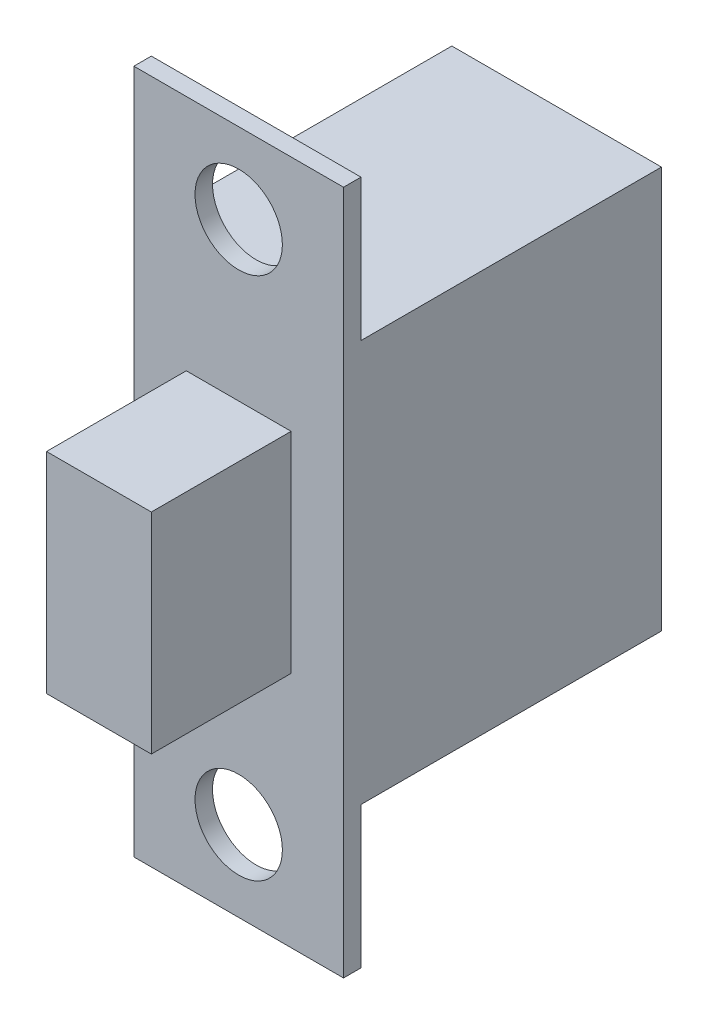
ISO-10303-21;
HEADER;
FILE_DESCRIPTION(('STEP AP214'),'2;1');
FILE_NAME('part.step','',(''),(''),'','','');
FILE_SCHEMA(('AUTOMOTIVE_DESIGN { 1 0 10303 214 1 1 1 1 }'));
ENDSEC;
DATA;
#1=APPLICATION_CONTEXT('core data for automotive mechanical design processes');
#2=APPLICATION_PROTOCOL_DEFINITION('international standard','automotive_design',2000,#1);
#3=PRODUCT_CONTEXT('',#1,'mechanical');
#4=PRODUCT('Part','Part','',(#3));
#5=PRODUCT_RELATED_PRODUCT_CATEGORY('part','',(#4));
#6=PRODUCT_DEFINITION_FORMATION('','',#4);
#7=PRODUCT_DEFINITION_CONTEXT('part definition',#1,'design');
#8=PRODUCT_DEFINITION('design','',#6,#7);
#9=PRODUCT_DEFINITION_SHAPE('','',#8);
#10=(LENGTH_UNIT() NAMED_UNIT(*) SI_UNIT(.MILLI.,.METRE.));
#11=(NAMED_UNIT(*) PLANE_ANGLE_UNIT() SI_UNIT($,.RADIAN.));
#12=(NAMED_UNIT(*) SI_UNIT($,.STERADIAN.) SOLID_ANGLE_UNIT());
#13=UNCERTAINTY_MEASURE_WITH_UNIT(LENGTH_MEASURE(1.E-05),#10,'distance_accuracy_value','');
#14=(GEOMETRIC_REPRESENTATION_CONTEXT(3) GLOBAL_UNCERTAINTY_ASSIGNED_CONTEXT((#13)) GLOBAL_UNIT_ASSIGNED_CONTEXT((#10,
#11,#12)) REPRESENTATION_CONTEXT('',''));
#15=CARTESIAN_POINT('',(0.,0.,0.));
#16=DIRECTION('',(0.,0.,1.));
#17=DIRECTION('',(1.,0.,0.));
#18=AXIS2_PLACEMENT_3D('',#15,#16,#17);
#19=CARTESIAN_POINT('',(0.,0.,0.));
#20=DIRECTION('',(0.,0.,1.));
#21=DIRECTION('',(1.,0.,0.));
#22=AXIS2_PLACEMENT_3D('',#19,#20,#21);
#23=PLANE('',#22);
#24=CARTESIAN_POINT('',(21.1258333333333,8.45291666666666,0.));
#25=DIRECTION('',(0.,0.,-1.));
#26=DIRECTION('',(-1.,0.,0.));
#27=AXIS2_PLACEMENT_3D('',#24,#25,#26);
#28=CIRCLE('',#27,1.25);
#29=CARTESIAN_POINT('',(19.8758333333333,8.45291666666666,0.));
#30=VERTEX_POINT('',#29);
#31=EDGE_CURVE('E211',#30,#30,#28,.T.);
#32=ORIENTED_EDGE('',*,*,#31,.F.);
#33=EDGE_LOOP('',(#32));
#34=FACE_BOUND('',#33,.T.);
#35=DIRECTION('',(0.,1.,0.));
#36=VECTOR('',#35,1.);
#37=CARTESIAN_POINT('',(24.1258333333333,10.7529166666667,0.));
#38=LINE('',#37,#36);
#39=CARTESIAN_POINT('',(24.1258333333333,6.70291666666666,0.));
#40=VERTEX_POINT('',#39);
#41=CARTESIAN_POINT('',(24.1258333333333,10.7529166666667,0.));
#42=VERTEX_POINT('',#41);
#43=EDGE_CURVE('E247',#40,#42,#38,.T.);
#44=ORIENTED_EDGE('',*,*,#43,.F.);
#45=DIRECTION('',(-1.,0.,0.));
#46=VECTOR('',#45,1.);
#47=CARTESIAN_POINT('',(0.,6.70291666666666,0.));
#48=LINE('',#47,#46);
#49=CARTESIAN_POINT('',(18.1258333333333,6.70291666666666,0.));
#50=VERTEX_POINT('',#49);
#51=EDGE_CURVE('E11',#40,#50,#48,.T.);
#52=ORIENTED_EDGE('',*,*,#51,.T.);
#53=DIRECTION('',(0.,-1.,0.));
#54=VECTOR('',#53,1.);
#55=CARTESIAN_POINT('',(18.1258333333333,10.7529166666667,0.));
#56=LINE('',#55,#54);
#57=CARTESIAN_POINT('',(18.1258333333333,10.7529166666667,0.));
#58=VERTEX_POINT('',#57);
#59=EDGE_CURVE('E241',#58,#50,#56,.T.);
#60=ORIENTED_EDGE('',*,*,#59,.F.);
#61=DIRECTION('',(-1.,0.,0.));
#62=VECTOR('',#61,1.);
#63=CARTESIAN_POINT('',(18.1258333333333,10.7529166666667,0.));
#64=LINE('',#63,#62);
#65=EDGE_CURVE('E231',#42,#58,#64,.T.);
#66=ORIENTED_EDGE('',*,*,#65,.F.);
#67=EDGE_LOOP('',(#44,#52,#60,#66));
#68=FACE_BOUND('',#67,.T.);
#69=ADVANCED_FACE('F43',(#34,#68),#23,.F.);
#70=CARTESIAN_POINT('',(0.,0.,0.5));
#71=DIRECTION('',(0.,0.,1.));
#72=DIRECTION('',(1.,0.,0.));
#73=AXIS2_PLACEMENT_3D('',#70,#71,#72);
#74=PLANE('',#73);
#75=DIRECTION('',(0.,1.,0.));
#76=VECTOR('',#75,1.);
#77=CARTESIAN_POINT('',(24.1258333333333,10.7529166666667,0.5));
#78=LINE('',#77,#76);
#79=CARTESIAN_POINT('',(24.1258333333333,-8.84708333333334,0.5));
#80=VERTEX_POINT('',#79);
#81=CARTESIAN_POINT('',(24.1258333333333,10.7529166666667,0.5));
#82=VERTEX_POINT('',#81);
#83=EDGE_CURVE('E234',#80,#82,#78,.T.);
#84=ORIENTED_EDGE('',*,*,#83,.T.);
#85=DIRECTION('',(-1.,0.,0.));
#86=VECTOR('',#85,1.);
#87=CARTESIAN_POINT('',(18.1258333333333,10.7529166666667,0.5));
#88=LINE('',#87,#86);
#89=CARTESIAN_POINT('',(18.1258333333333,10.7529166666667,0.5));
#90=VERTEX_POINT('',#89);
#91=EDGE_CURVE('E237',#82,#90,#88,.T.);
#92=ORIENTED_EDGE('',*,*,#91,.T.);
#93=DIRECTION('',(0.,-1.,0.));
#94=VECTOR('',#93,1.);
#95=CARTESIAN_POINT('',(18.1258333333333,10.7529166666667,0.5));
#96=LINE('',#95,#94);
#97=CARTESIAN_POINT('',(18.1258333333333,-8.84708333333334,0.5));
#98=VERTEX_POINT('',#97);
#99=EDGE_CURVE('E227',#90,#98,#96,.T.);
#100=ORIENTED_EDGE('',*,*,#99,.T.);
#101=DIRECTION('',(1.,0.,0.));
#102=VECTOR('',#101,1.);
#103=CARTESIAN_POINT('',(18.1258333333333,-8.84708333333334,0.5));
#104=LINE('',#103,#102);
#105=EDGE_CURVE('E230',#98,#80,#104,.T.);
#106=ORIENTED_EDGE('',*,*,#105,.T.);
#107=EDGE_LOOP('',(#84,#92,#100,#106));
#108=FACE_BOUND('',#107,.T.);
#109=CARTESIAN_POINT('',(21.1258333333333,-6.54708333333334,0.5));
#110=DIRECTION('',(0.,0.,1.));
#111=DIRECTION('',(1.,0.,0.));
#112=AXIS2_PLACEMENT_3D('',#109,#110,#111);
#113=CIRCLE('',#112,1.25);
#114=CARTESIAN_POINT('',(22.3758333333333,-6.54708333333334,0.5));
#115=VERTEX_POINT('',#114);
#116=EDGE_CURVE('E215',#115,#115,#113,.T.);
#117=ORIENTED_EDGE('',*,*,#116,.F.);
#118=EDGE_LOOP('',(#117));
#119=FACE_BOUND('',#118,.T.);
#120=DIRECTION('',(1.,0.,0.));
#121=VECTOR('',#120,1.);
#122=CARTESIAN_POINT('',(19.6258333333333,-2.04708333333334,0.5));
#123=LINE('',#122,#121);
#124=CARTESIAN_POINT('',(19.6258333333333,-2.04708333333334,0.5));
#125=VERTEX_POINT('',#124);
#126=CARTESIAN_POINT('',(22.6258333333333,-2.04708333333334,0.5));
#127=VERTEX_POINT('',#126);
#128=EDGE_CURVE('E190',#125,#127,#123,.T.);
#129=ORIENTED_EDGE('',*,*,#128,.F.);
#130=DIRECTION('',(0.,-1.,0.));
#131=VECTOR('',#130,1.);
#132=CARTESIAN_POINT('',(19.6258333333333,3.95291666666666,0.5));
#133=LINE('',#132,#131);
#134=CARTESIAN_POINT('',(19.6258333333333,3.95291666666666,0.5));
#135=VERTEX_POINT('',#134);
#136=EDGE_CURVE('E165',#135,#125,#133,.T.);
#137=ORIENTED_EDGE('',*,*,#136,.F.);
#138=DIRECTION('',(-1.,0.,0.));
#139=VECTOR('',#138,1.);
#140=CARTESIAN_POINT('',(19.6258333333333,3.95291666666666,0.5));
#141=LINE('',#140,#139);
#142=CARTESIAN_POINT('',(22.6258333333333,3.95291666666666,0.5));
#143=VERTEX_POINT('',#142);
#144=EDGE_CURVE('E177',#143,#135,#141,.T.);
#145=ORIENTED_EDGE('',*,*,#144,.F.);
#146=DIRECTION('',(0.,1.,0.));
#147=VECTOR('',#146,1.);
#148=CARTESIAN_POINT('',(22.6258333333333,3.95291666666666,0.5));
#149=LINE('',#148,#147);
#150=EDGE_CURVE('E193',#127,#143,#149,.T.);
#151=ORIENTED_EDGE('',*,*,#150,.F.);
#152=EDGE_LOOP('',(#129,#137,#145,#151));
#153=FACE_BOUND('',#152,.T.);
#154=CARTESIAN_POINT('',(21.1258333333333,8.45291666666666,0.5));
#155=DIRECTION('',(0.,0.,1.));
#156=DIRECTION('',(1.,0.,0.));
#157=AXIS2_PLACEMENT_3D('',#154,#155,#156);
#158=CIRCLE('',#157,1.25);
#159=CARTESIAN_POINT('',(22.3758333333333,8.45291666666666,0.5));
#160=VERTEX_POINT('',#159);
#161=EDGE_CURVE('E222',#160,#160,#158,.T.);
#162=ORIENTED_EDGE('',*,*,#161,.F.);
#163=EDGE_LOOP('',(#162));
#164=FACE_BOUND('',#163,.T.);
#165=ADVANCED_FACE('F307',(#108,#119,#153,#164),#74,.T.);
#166=CARTESIAN_POINT('',(18.1258333333333,10.7529166666667,0.5));
#167=DIRECTION('',(1.,0.,0.));
#168=DIRECTION('',(0.,1.,0.));
#169=AXIS2_PLACEMENT_3D('',#166,#167,#168);
#170=PLANE('',#169);
#171=DIRECTION('',(0.,0.,-1.));
#172=VECTOR('',#171,1.);
#173=CARTESIAN_POINT('',(18.1258333333333,-8.84708333333334,0.5));
#174=LINE('',#173,#172);
#175=CARTESIAN_POINT('',(18.1258333333333,-8.84708333333334,0.));
#176=VERTEX_POINT('',#175);
#177=EDGE_CURVE('E265',#98,#176,#174,.T.);
#178=ORIENTED_EDGE('',*,*,#177,.F.);
#179=ORIENTED_EDGE('',*,*,#99,.F.);
#180=DIRECTION('',(0.,0.,-1.));
#181=VECTOR('',#180,1.);
#182=CARTESIAN_POINT('',(18.1258333333333,10.7529166666667,0.5));
#183=LINE('',#182,#181);
#184=EDGE_CURVE('E240',#90,#58,#183,.T.);
#185=ORIENTED_EDGE('',*,*,#184,.T.);
#186=ORIENTED_EDGE('',*,*,#59,.T.);
#187=DIRECTION('',(0.,0.,1.));
#188=VECTOR('',#187,1.);
#189=CARTESIAN_POINT('',(18.1258333333333,6.70291666666666,-8.6));
#190=LINE('',#189,#188);
#191=CARTESIAN_POINT('',(18.1258333333333,6.70291666666666,-8.6));
#192=VERTEX_POINT('',#191);
#193=EDGE_CURVE('E155',#192,#50,#190,.T.);
#194=ORIENTED_EDGE('',*,*,#193,.F.);
#195=DIRECTION('',(0.,-1.,0.));
#196=VECTOR('',#195,1.);
#197=CARTESIAN_POINT('',(18.1258333333333,6.70291666666666,-8.6));
#198=LINE('',#197,#196);
#199=CARTESIAN_POINT('',(18.1258333333333,-4.79708333333333,-8.6));
#200=VERTEX_POINT('',#199);
#201=EDGE_CURVE('E147',#192,#200,#198,.T.);
#202=ORIENTED_EDGE('',*,*,#201,.T.);
#203=DIRECTION('',(0.,0.,1.));
#204=VECTOR('',#203,1.);
#205=CARTESIAN_POINT('',(18.1258333333333,-4.79708333333333,-8.6));
#206=LINE('',#205,#204);
#207=CARTESIAN_POINT('',(18.1258333333333,-4.79708333333333,0.));
#208=VERTEX_POINT('',#207);
#209=EDGE_CURVE('E132',#200,#208,#206,.T.);
#210=ORIENTED_EDGE('',*,*,#209,.T.);
#211=EDGE_CURVE('E226',#208,#176,#56,.T.);
#212=ORIENTED_EDGE('',*,*,#211,.T.);
#213=EDGE_LOOP('',(#178,#179,#185,#186,#194,#202,#210,#212));
#214=FACE_BOUND('',#213,.T.);
#215=ADVANCED_FACE('F45',(#214),#170,.F.);
#216=CARTESIAN_POINT('',(18.1258333333333,-8.84708333333334,0.5));
#217=DIRECTION('',(0.,1.,0.));
#218=DIRECTION('',(0.,0.,1.));
#219=AXIS2_PLACEMENT_3D('',#216,#217,#218);
#220=PLANE('',#219);
#221=DIRECTION('',(1.,0.,0.));
#222=VECTOR('',#221,1.);
#223=CARTESIAN_POINT('',(18.1258333333333,-8.84708333333334,0.));
#224=LINE('',#223,#222);
#225=CARTESIAN_POINT('',(24.1258333333333,-8.84708333333334,0.));
#226=VERTEX_POINT('',#225);
#227=EDGE_CURVE('E244',#176,#226,#224,.T.);
#228=ORIENTED_EDGE('',*,*,#227,.T.);
#229=DIRECTION('',(0.,0.,-1.));
#230=VECTOR('',#229,1.);
#231=CARTESIAN_POINT('',(24.1258333333333,-8.84708333333334,0.5));
#232=LINE('',#231,#230);
#233=EDGE_CURVE('E261',#80,#226,#232,.T.);
#234=ORIENTED_EDGE('',*,*,#233,.F.);
#235=ORIENTED_EDGE('',*,*,#105,.F.);
#236=ORIENTED_EDGE('',*,*,#177,.T.);
#237=EDGE_LOOP('',(#228,#234,#235,#236));
#238=FACE_BOUND('',#237,.T.);
#239=ADVANCED_FACE('F280',(#238),#220,.F.);
#240=CARTESIAN_POINT('',(24.1258333333333,10.7529166666667,0.5));
#241=DIRECTION('',(-1.,0.,0.));
#242=DIRECTION('',(0.,-1.,0.));
#243=AXIS2_PLACEMENT_3D('',#240,#241,#242);
#244=PLANE('',#243);
#245=CARTESIAN_POINT('',(24.1258333333333,-4.79708333333334,0.));
#246=VERTEX_POINT('',#245);
#247=EDGE_CURVE('E248',#226,#246,#38,.T.);
#248=ORIENTED_EDGE('',*,*,#247,.T.);
#249=DIRECTION('',(0.,0.,1.));
#250=VECTOR('',#249,1.);
#251=CARTESIAN_POINT('',(24.1258333333333,-4.79708333333334,-8.6));
#252=LINE('',#251,#250);
#253=CARTESIAN_POINT('',(24.1258333333333,-4.79708333333334,-8.6));
#254=VERTEX_POINT('',#253);
#255=EDGE_CURVE('E59',#254,#246,#252,.T.);
#256=ORIENTED_EDGE('',*,*,#255,.F.);
#257=DIRECTION('',(0.,1.,0.));
#258=VECTOR('',#257,1.);
#259=CARTESIAN_POINT('',(24.1258333333333,6.70291666666666,-8.6));
#260=LINE('',#259,#258);
#261=CARTESIAN_POINT('',(24.1258333333333,6.70291666666666,-8.6));
#262=VERTEX_POINT('',#261);
#263=EDGE_CURVE('E150',#254,#262,#260,.T.);
#264=ORIENTED_EDGE('',*,*,#263,.T.);
#265=DIRECTION('',(0.,0.,1.));
#266=VECTOR('',#265,1.);
#267=CARTESIAN_POINT('',(24.1258333333333,6.70291666666666,-8.6));
#268=LINE('',#267,#266);
#269=EDGE_CURVE('E166',#262,#40,#268,.T.);
#270=ORIENTED_EDGE('',*,*,#269,.T.);
#271=ORIENTED_EDGE('',*,*,#43,.T.);
#272=DIRECTION('',(0.,0.,-1.));
#273=VECTOR('',#272,1.);
#274=CARTESIAN_POINT('',(24.1258333333333,10.7529166666667,0.5));
#275=LINE('',#274,#273);
#276=EDGE_CURVE('E257',#82,#42,#275,.T.);
#277=ORIENTED_EDGE('',*,*,#276,.F.);
#278=ORIENTED_EDGE('',*,*,#83,.F.);
#279=ORIENTED_EDGE('',*,*,#233,.T.);
#280=EDGE_LOOP('',(#248,#256,#264,#270,#271,#277,#278,#279));
#281=FACE_BOUND('',#280,.T.);
#282=ADVANCED_FACE('F274',(#281),#244,.F.);
#283=CARTESIAN_POINT('',(18.1258333333333,10.7529166666667,0.5));
#284=DIRECTION('',(0.,-1.,0.));
#285=DIRECTION('',(0.,0.,-1.));
#286=AXIS2_PLACEMENT_3D('',#283,#284,#285);
#287=PLANE('',#286);
#288=ORIENTED_EDGE('',*,*,#65,.T.);
#289=ORIENTED_EDGE('',*,*,#184,.F.);
#290=ORIENTED_EDGE('',*,*,#91,.F.);
#291=ORIENTED_EDGE('',*,*,#276,.T.);
#292=EDGE_LOOP('',(#288,#289,#290,#291));
#293=FACE_BOUND('',#292,.T.);
#294=ADVANCED_FACE('F289',(#293),#287,.F.);
#295=CARTESIAN_POINT('',(21.1258333333333,-6.54708333333334,0.));
#296=DIRECTION('',(0.,0.,-1.));
#297=DIRECTION('',(-1.,0.,0.));
#298=AXIS2_PLACEMENT_3D('',#295,#296,#297);
#299=CIRCLE('',#298,1.25);
#300=CARTESIAN_POINT('',(19.8758333333333,-6.54708333333334,0.));
#301=VERTEX_POINT('',#300);
#302=EDGE_CURVE('E210',#301,#301,#299,.T.);
#303=ORIENTED_EDGE('',*,*,#302,.F.);
#304=EDGE_LOOP('',(#303));
#305=FACE_BOUND('',#304,.T.);
#306=ORIENTED_EDGE('',*,*,#211,.F.);
#307=DIRECTION('',(1.,0.,0.));
#308=VECTOR('',#307,1.);
#309=CARTESIAN_POINT('',(0.,-4.79708333333333,0.));
#310=LINE('',#309,#308);
#311=EDGE_CURVE('E52',#208,#246,#310,.T.);
#312=ORIENTED_EDGE('',*,*,#311,.T.);
#313=ORIENTED_EDGE('',*,*,#247,.F.);
#314=ORIENTED_EDGE('',*,*,#227,.F.);
#315=EDGE_LOOP('',(#306,#312,#313,#314));
#316=FACE_BOUND('',#315,.T.);
#317=ADVANCED_FACE('F271',(#305,#316),#23,.F.);
#318=CARTESIAN_POINT('',(21.1258333333333,-6.54708333333334,1.));
#319=DIRECTION('',(0.,0.,-1.));
#320=DIRECTION('',(-1.,0.,0.));
#321=AXIS2_PLACEMENT_3D('',#318,#319,#320);
#322=CYLINDRICAL_SURFACE('',#321,1.25);
#323=ORIENTED_EDGE('',*,*,#116,.T.);
#324=EDGE_LOOP('',(#323));
#325=FACE_BOUND('',#324,.T.);
#326=ORIENTED_EDGE('',*,*,#302,.T.);
#327=EDGE_LOOP('',(#326));
#328=FACE_BOUND('',#327,.T.);
#329=ADVANCED_FACE('F318',(#325,#328),#322,.F.);
#330=CARTESIAN_POINT('',(21.1258333333333,8.45291666666666,1.));
#331=DIRECTION('',(0.,0.,-1.));
#332=DIRECTION('',(-1.,0.,0.));
#333=AXIS2_PLACEMENT_3D('',#330,#331,#332);
#334=CYLINDRICAL_SURFACE('',#333,1.25);
#335=ORIENTED_EDGE('',*,*,#161,.T.);
#336=EDGE_LOOP('',(#335));
#337=FACE_BOUND('',#336,.T.);
#338=ORIENTED_EDGE('',*,*,#31,.T.);
#339=EDGE_LOOP('',(#338));
#340=FACE_BOUND('',#339,.T.);
#341=ADVANCED_FACE('F324',(#337,#340),#334,.F.);
#342=CARTESIAN_POINT('',(19.6258333333333,3.95291666666666,4.5));
#343=DIRECTION('',(1.,0.,0.));
#344=DIRECTION('',(0.,0.,-1.));
#345=AXIS2_PLACEMENT_3D('',#342,#343,#344);
#346=PLANE('',#345);
#347=ORIENTED_EDGE('',*,*,#136,.T.);
#348=DIRECTION('',(0.,0.,-1.));
#349=VECTOR('',#348,1.);
#350=CARTESIAN_POINT('',(19.6258333333333,-2.04708333333334,4.5));
#351=LINE('',#350,#349);
#352=CARTESIAN_POINT('',(19.6258333333333,-2.04708333333334,4.5));
#353=VERTEX_POINT('',#352);
#354=EDGE_CURVE('E207',#353,#125,#351,.T.);
#355=ORIENTED_EDGE('',*,*,#354,.F.);
#356=DIRECTION('',(0.,-1.,0.));
#357=VECTOR('',#356,1.);
#358=CARTESIAN_POINT('',(19.6258333333333,3.95291666666666,4.5));
#359=LINE('',#358,#357);
#360=CARTESIAN_POINT('',(19.6258333333333,3.95291666666666,4.5));
#361=VERTEX_POINT('',#360);
#362=EDGE_CURVE('E172',#361,#353,#359,.T.);
#363=ORIENTED_EDGE('',*,*,#362,.F.);
#364=DIRECTION('',(0.,0.,-1.));
#365=VECTOR('',#364,1.);
#366=CARTESIAN_POINT('',(19.6258333333333,3.95291666666666,4.5));
#367=LINE('',#366,#365);
#368=EDGE_CURVE('E186',#361,#135,#367,.T.);
#369=ORIENTED_EDGE('',*,*,#368,.T.);
#370=EDGE_LOOP('',(#347,#355,#363,#369));
#371=FACE_BOUND('',#370,.T.);
#372=ADVANCED_FACE('F359',(#371),#346,.F.);
#373=CARTESIAN_POINT('',(19.6258333333333,-2.04708333333334,4.5));
#374=DIRECTION('',(0.,1.,0.));
#375=DIRECTION('',(0.,0.,1.));
#376=AXIS2_PLACEMENT_3D('',#373,#374,#375);
#377=PLANE('',#376);
#378=ORIENTED_EDGE('',*,*,#128,.T.);
#379=DIRECTION('',(0.,0.,-1.));
#380=VECTOR('',#379,1.);
#381=CARTESIAN_POINT('',(22.6258333333333,-2.04708333333334,4.5));
#382=LINE('',#381,#380);
#383=CARTESIAN_POINT('',(22.6258333333333,-2.04708333333334,4.5));
#384=VERTEX_POINT('',#383);
#385=EDGE_CURVE('E203',#384,#127,#382,.T.);
#386=ORIENTED_EDGE('',*,*,#385,.F.);
#387=DIRECTION('',(1.,0.,0.));
#388=VECTOR('',#387,1.);
#389=CARTESIAN_POINT('',(19.6258333333333,-2.04708333333334,4.5));
#390=LINE('',#389,#388);
#391=EDGE_CURVE('E176',#353,#384,#390,.T.);
#392=ORIENTED_EDGE('',*,*,#391,.F.);
#393=ORIENTED_EDGE('',*,*,#354,.T.);
#394=EDGE_LOOP('',(#378,#386,#392,#393));
#395=FACE_BOUND('',#394,.T.);
#396=ADVANCED_FACE('F410',(#395),#377,.F.);
#397=CARTESIAN_POINT('',(22.6258333333333,3.95291666666666,4.5));
#398=DIRECTION('',(-1.,0.,0.));
#399=DIRECTION('',(0.,0.,1.));
#400=AXIS2_PLACEMENT_3D('',#397,#398,#399);
#401=PLANE('',#400);
#402=ORIENTED_EDGE('',*,*,#150,.T.);
#403=DIRECTION('',(0.,0.,-1.));
#404=VECTOR('',#403,1.);
#405=CARTESIAN_POINT('',(22.6258333333333,3.95291666666666,4.5));
#406=LINE('',#405,#404);
#407=CARTESIAN_POINT('',(22.6258333333333,3.95291666666666,4.5));
#408=VERTEX_POINT('',#407);
#409=EDGE_CURVE('E67',#408,#143,#406,.T.);
#410=ORIENTED_EDGE('',*,*,#409,.F.);
#411=DIRECTION('',(0.,1.,0.));
#412=VECTOR('',#411,1.);
#413=CARTESIAN_POINT('',(22.6258333333333,3.95291666666666,4.5));
#414=LINE('',#413,#412);
#415=EDGE_CURVE('E180',#384,#408,#414,.T.);
#416=ORIENTED_EDGE('',*,*,#415,.F.);
#417=ORIENTED_EDGE('',*,*,#385,.T.);
#418=EDGE_LOOP('',(#402,#410,#416,#417));
#419=FACE_BOUND('',#418,.T.);
#420=ADVANCED_FACE('F421',(#419),#401,.F.);
#421=CARTESIAN_POINT('',(19.6258333333333,3.95291666666666,4.5));
#422=DIRECTION('',(0.,-1.,0.));
#423=DIRECTION('',(0.,0.,-1.));
#424=AXIS2_PLACEMENT_3D('',#421,#422,#423);
#425=PLANE('',#424);
#426=ORIENTED_EDGE('',*,*,#144,.T.);
#427=ORIENTED_EDGE('',*,*,#368,.F.);
#428=DIRECTION('',(-1.,0.,0.));
#429=VECTOR('',#428,1.);
#430=CARTESIAN_POINT('',(19.6258333333333,3.95291666666666,4.5));
#431=LINE('',#430,#429);
#432=EDGE_CURVE('E183',#408,#361,#431,.T.);
#433=ORIENTED_EDGE('',*,*,#432,.F.);
#434=ORIENTED_EDGE('',*,*,#409,.T.);
#435=EDGE_LOOP('',(#426,#427,#433,#434));
#436=FACE_BOUND('',#435,.T.);
#437=ADVANCED_FACE('F302',(#436),#425,.F.);
#438=CARTESIAN_POINT('',(0.,0.,4.5));
#439=DIRECTION('',(0.,0.,1.));
#440=DIRECTION('',(1.,0.,0.));
#441=AXIS2_PLACEMENT_3D('',#438,#439,#440);
#442=PLANE('',#441);
#443=ORIENTED_EDGE('',*,*,#362,.T.);
#444=ORIENTED_EDGE('',*,*,#391,.T.);
#445=ORIENTED_EDGE('',*,*,#415,.T.);
#446=ORIENTED_EDGE('',*,*,#432,.T.);
#447=EDGE_LOOP('',(#443,#444,#445,#446));
#448=FACE_BOUND('',#447,.T.);
#449=ADVANCED_FACE('F295',(#448),#442,.T.);
#450=CARTESIAN_POINT('',(18.1258333333333,6.70291666666666,-8.6));
#451=DIRECTION('',(0.,1.,0.));
#452=DIRECTION('',(0.,0.,1.));
#453=AXIS2_PLACEMENT_3D('',#450,#451,#452);
#454=PLANE('',#453);
#455=ORIENTED_EDGE('',*,*,#51,.F.);
#456=ORIENTED_EDGE('',*,*,#269,.F.);
#457=DIRECTION('',(-1.,0.,0.));
#458=VECTOR('',#457,1.);
#459=CARTESIAN_POINT('',(18.1258333333333,6.70291666666666,-8.6));
#460=LINE('',#459,#458);
#461=EDGE_CURVE('E140',#262,#192,#460,.T.);
#462=ORIENTED_EDGE('',*,*,#461,.T.);
#463=ORIENTED_EDGE('',*,*,#193,.T.);
#464=EDGE_LOOP('',(#455,#456,#462,#463));
#465=FACE_BOUND('',#464,.T.);
#466=ADVANCED_FACE('F293',(#465),#454,.T.);
#467=CARTESIAN_POINT('',(18.1258333333333,-4.79708333333333,-8.6));
#468=DIRECTION('',(0.,-1.,0.));
#469=DIRECTION('',(1.,0.,0.));
#470=AXIS2_PLACEMENT_3D('',#467,#468,#469);
#471=PLANE('',#470);
#472=ORIENTED_EDGE('',*,*,#311,.F.);
#473=ORIENTED_EDGE('',*,*,#209,.F.);
#474=DIRECTION('',(1.,0.,0.));
#475=VECTOR('',#474,1.);
#476=CARTESIAN_POINT('',(18.1258333333333,-4.79708333333333,-8.6));
#477=LINE('',#476,#475);
#478=EDGE_CURVE('E135',#200,#254,#477,.T.);
#479=ORIENTED_EDGE('',*,*,#478,.T.);
#480=ORIENTED_EDGE('',*,*,#255,.T.);
#481=EDGE_LOOP('',(#472,#473,#479,#480));
#482=FACE_BOUND('',#481,.T.);
#483=ADVANCED_FACE('F134',(#482),#471,.T.);
#484=CARTESIAN_POINT('',(0.,0.,-8.6));
#485=DIRECTION('',(0.,0.,1.));
#486=DIRECTION('',(1.,0.,0.));
#487=AXIS2_PLACEMENT_3D('',#484,#485,#486);
#488=PLANE('',#487);
#489=ORIENTED_EDGE('',*,*,#201,.F.);
#490=ORIENTED_EDGE('',*,*,#461,.F.);
#491=ORIENTED_EDGE('',*,*,#263,.F.);
#492=ORIENTED_EDGE('',*,*,#478,.F.);
#493=EDGE_LOOP('',(#489,#490,#491,#492));
#494=FACE_BOUND('',#493,.T.);
#495=ADVANCED_FACE('F145',(#494),#488,.F.);
#496=CLOSED_SHELL('',(#69,#165,#215,#239,#282,#294,#317,#329,#341,#372,#396,#420,#437,#449,#466,
#483,#495));
#497=MANIFOLD_SOLID_BREP('B2',#496);
#498=ADVANCED_BREP_SHAPE_REPRESENTATION('',(#18,#497),#14);
#499=SHAPE_DEFINITION_REPRESENTATION(#9,#498);
ENDSEC;
END-ISO-10303-21;
